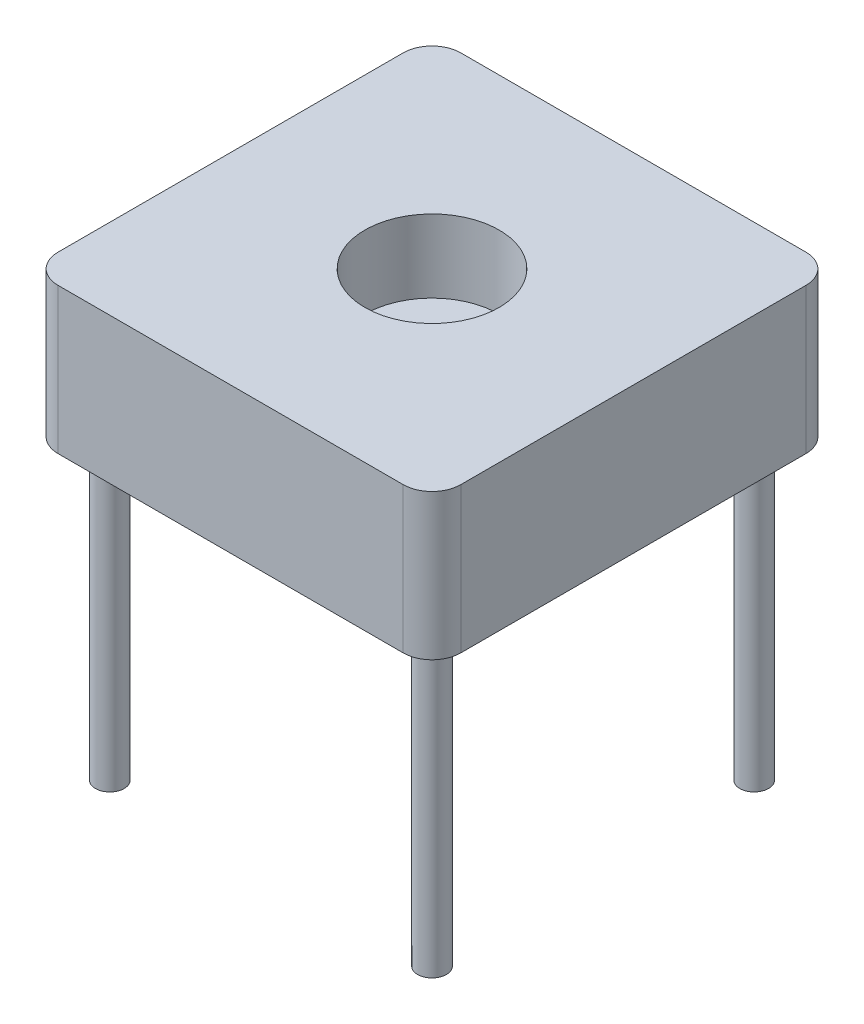
ISO-10303-21;
HEADER;
FILE_DESCRIPTION(('STEP AP214'),'2;1');
FILE_NAME('part.step','',(''),(''),'','','');
FILE_SCHEMA(('AUTOMOTIVE_DESIGN { 1 0 10303 214 1 1 1 1 }'));
ENDSEC;
DATA;
#1=APPLICATION_CONTEXT('core data for automotive mechanical design processes');
#2=APPLICATION_PROTOCOL_DEFINITION('international standard','automotive_design',2000,#1);
#3=PRODUCT_CONTEXT('',#1,'mechanical');
#4=PRODUCT('Part','Part','',(#3));
#5=PRODUCT_RELATED_PRODUCT_CATEGORY('part','',(#4));
#6=PRODUCT_DEFINITION_FORMATION('','',#4);
#7=PRODUCT_DEFINITION_CONTEXT('part definition',#1,'design');
#8=PRODUCT_DEFINITION('design','',#6,#7);
#9=PRODUCT_DEFINITION_SHAPE('','',#8);
#10=(LENGTH_UNIT() NAMED_UNIT(*) SI_UNIT(.MILLI.,.METRE.));
#11=(NAMED_UNIT(*) PLANE_ANGLE_UNIT() SI_UNIT($,.RADIAN.));
#12=(NAMED_UNIT(*) SI_UNIT($,.STERADIAN.) SOLID_ANGLE_UNIT());
#13=UNCERTAINTY_MEASURE_WITH_UNIT(LENGTH_MEASURE(1.E-05),#10,'distance_accuracy_value','');
#14=(GEOMETRIC_REPRESENTATION_CONTEXT(3) GLOBAL_UNCERTAINTY_ASSIGNED_CONTEXT((#13)) GLOBAL_UNIT_ASSIGNED_CONTEXT((#10,
#11,#12)) REPRESENTATION_CONTEXT('',''));
#15=CARTESIAN_POINT('',(0.,0.,0.));
#16=DIRECTION('',(0.,0.,1.));
#17=DIRECTION('',(1.,0.,0.));
#18=AXIS2_PLACEMENT_3D('',#15,#16,#17);
#19=CARTESIAN_POINT('',(0.75,3.8,-9.75));
#20=DIRECTION('',(0.,-1.,0.));
#21=DIRECTION('',(0.,0.,-1.));
#22=AXIS2_PLACEMENT_3D('',#19,#20,#21);
#23=CYLINDRICAL_SURFACE('',#22,0.75);
#24=CARTESIAN_POINT('',(0.75,0.,-9.75));
#25=DIRECTION('',(0.,1.,0.));
#26=DIRECTION('',(0.,0.,-1.));
#27=AXIS2_PLACEMENT_3D('',#24,#25,#26);
#28=CIRCLE('',#27,0.75);
#29=CARTESIAN_POINT('',(0.750000000000005,0.,-10.5));
#30=VERTEX_POINT('',#29);
#31=CARTESIAN_POINT('',(0.,0.,-9.74999999999999));
#32=VERTEX_POINT('',#31);
#33=EDGE_CURVE('E133',#30,#32,#28,.T.);
#34=ORIENTED_EDGE('',*,*,#33,.T.);
#35=DIRECTION('',(0.,-1.,0.));
#36=VECTOR('',#35,1.);
#37=CARTESIAN_POINT('',(0.,3.8,-9.74999999999999));
#38=LINE('',#37,#36);
#39=CARTESIAN_POINT('',(0.,3.8,-9.74999999999999));
#40=VERTEX_POINT('',#39);
#41=EDGE_CURVE('E11',#40,#32,#38,.T.);
#42=ORIENTED_EDGE('',*,*,#41,.F.);
#43=CARTESIAN_POINT('',(0.75,3.8,-9.75));
#44=DIRECTION('',(0.,1.,0.));
#45=DIRECTION('',(0.,0.,-1.));
#46=AXIS2_PLACEMENT_3D('',#43,#44,#45);
#47=CIRCLE('',#46,0.75);
#48=CARTESIAN_POINT('',(0.750000000000005,3.8,-10.5));
#49=VERTEX_POINT('',#48);
#50=EDGE_CURVE('E148',#49,#40,#47,.T.);
#51=ORIENTED_EDGE('',*,*,#50,.F.);
#52=DIRECTION('',(0.,-1.,0.));
#53=VECTOR('',#52,1.);
#54=CARTESIAN_POINT('',(0.750000000000005,3.8,-10.5));
#55=LINE('',#54,#53);
#56=EDGE_CURVE('E129',#49,#30,#55,.T.);
#57=ORIENTED_EDGE('',*,*,#56,.T.);
#58=EDGE_LOOP('',(#34,#42,#51,#57));
#59=FACE_BOUND('',#58,.T.);
#60=ADVANCED_FACE('F37',(#59),#23,.T.);
#61=CARTESIAN_POINT('',(0.,3.8,-0.750000000000005));
#62=DIRECTION('',(1.,0.,0.));
#63=DIRECTION('',(0.,0.,-1.));
#64=AXIS2_PLACEMENT_3D('',#61,#62,#63);
#65=PLANE('',#64);
#66=DIRECTION('',(0.,0.,1.));
#67=VECTOR('',#66,1.);
#68=CARTESIAN_POINT('',(0.,0.,-0.750000000000005));
#69=LINE('',#68,#67);
#70=CARTESIAN_POINT('',(0.,0.,-0.750000000000005));
#71=VERTEX_POINT('',#70);
#72=EDGE_CURVE('E136',#32,#71,#69,.T.);
#73=ORIENTED_EDGE('',*,*,#72,.T.);
#74=DIRECTION('',(0.,-1.,0.));
#75=VECTOR('',#74,1.);
#76=CARTESIAN_POINT('',(0.,3.8,-0.750000000000005));
#77=LINE('',#76,#75);
#78=CARTESIAN_POINT('',(0.,3.8,-0.750000000000005));
#79=VERTEX_POINT('',#78);
#80=EDGE_CURVE('E45',#79,#71,#77,.T.);
#81=ORIENTED_EDGE('',*,*,#80,.F.);
#82=DIRECTION('',(0.,0.,1.));
#83=VECTOR('',#82,1.);
#84=CARTESIAN_POINT('',(0.,3.8,-0.750000000000005));
#85=LINE('',#84,#83);
#86=EDGE_CURVE('E96',#40,#79,#85,.T.);
#87=ORIENTED_EDGE('',*,*,#86,.F.);
#88=ORIENTED_EDGE('',*,*,#41,.T.);
#89=EDGE_LOOP('',(#73,#81,#87,#88));
#90=FACE_BOUND('',#89,.T.);
#91=ADVANCED_FACE('F247',(#90),#65,.F.);
#92=CARTESIAN_POINT('',(0.75,3.8,-0.75));
#93=DIRECTION('',(0.,-1.,0.));
#94=DIRECTION('',(0.,0.,-1.));
#95=AXIS2_PLACEMENT_3D('',#92,#93,#94);
#96=CYLINDRICAL_SURFACE('',#95,0.75);
#97=CARTESIAN_POINT('',(0.75,0.,-0.75));
#98=DIRECTION('',(0.,1.,0.));
#99=DIRECTION('',(0.,0.,-1.));
#100=AXIS2_PLACEMENT_3D('',#97,#98,#99);
#101=CIRCLE('',#100,0.75);
#102=CARTESIAN_POINT('',(0.750000000000005,0.,0.));
#103=VERTEX_POINT('',#102);
#104=EDGE_CURVE('E139',#71,#103,#101,.T.);
#105=ORIENTED_EDGE('',*,*,#104,.T.);
#106=DIRECTION('',(0.,-1.,0.));
#107=VECTOR('',#106,1.);
#108=CARTESIAN_POINT('',(0.750000000000005,3.8,0.));
#109=LINE('',#108,#107);
#110=CARTESIAN_POINT('',(0.750000000000005,3.8,0.));
#111=VERTEX_POINT('',#110);
#112=EDGE_CURVE('E155',#111,#103,#109,.T.);
#113=ORIENTED_EDGE('',*,*,#112,.F.);
#114=CARTESIAN_POINT('',(0.75,3.8,-0.75));
#115=DIRECTION('',(0.,1.,0.));
#116=DIRECTION('',(0.,0.,-1.));
#117=AXIS2_PLACEMENT_3D('',#114,#115,#116);
#118=CIRCLE('',#117,0.75);
#119=EDGE_CURVE('E163',#79,#111,#118,.T.);
#120=ORIENTED_EDGE('',*,*,#119,.F.);
#121=ORIENTED_EDGE('',*,*,#80,.T.);
#122=EDGE_LOOP('',(#105,#113,#120,#121));
#123=FACE_BOUND('',#122,.T.);
#124=ADVANCED_FACE('F161',(#123),#96,.T.);
#125=CARTESIAN_POINT('',(0.750000000000005,3.8,0.));
#126=DIRECTION('',(0.,0.,-1.));
#127=DIRECTION('',(-1.,0.,0.));
#128=AXIS2_PLACEMENT_3D('',#125,#126,#127);
#129=PLANE('',#128);
#130=DIRECTION('',(1.,0.,0.));
#131=VECTOR('',#130,1.);
#132=CARTESIAN_POINT('',(0.750000000000005,0.,0.));
#133=LINE('',#132,#131);
#134=CARTESIAN_POINT('',(9.74999999999999,0.,0.));
#135=VERTEX_POINT('',#134);
#136=EDGE_CURVE('E141',#103,#135,#133,.T.);
#137=ORIENTED_EDGE('',*,*,#136,.T.);
#138=DIRECTION('',(0.,-1.,0.));
#139=VECTOR('',#138,1.);
#140=CARTESIAN_POINT('',(9.74999999999999,3.8,0.));
#141=LINE('',#140,#139);
#142=CARTESIAN_POINT('',(9.74999999999999,3.8,0.));
#143=VERTEX_POINT('',#142);
#144=EDGE_CURVE('E152',#143,#135,#141,.T.);
#145=ORIENTED_EDGE('',*,*,#144,.F.);
#146=DIRECTION('',(1.,0.,0.));
#147=VECTOR('',#146,1.);
#148=CARTESIAN_POINT('',(0.750000000000005,3.8,0.));
#149=LINE('',#148,#147);
#150=EDGE_CURVE('E175',#111,#143,#149,.T.);
#151=ORIENTED_EDGE('',*,*,#150,.F.);
#152=ORIENTED_EDGE('',*,*,#112,.T.);
#153=EDGE_LOOP('',(#137,#145,#151,#152));
#154=FACE_BOUND('',#153,.T.);
#155=ADVANCED_FACE('F171',(#154),#129,.F.);
#156=CARTESIAN_POINT('',(9.75,3.8,-0.75));
#157=DIRECTION('',(0.,-1.,0.));
#158=DIRECTION('',(0.,0.,-1.));
#159=AXIS2_PLACEMENT_3D('',#156,#157,#158);
#160=CYLINDRICAL_SURFACE('',#159,0.75);
#161=CARTESIAN_POINT('',(9.75,0.,-0.75));
#162=DIRECTION('',(0.,1.,0.));
#163=DIRECTION('',(0.,0.,-1.));
#164=AXIS2_PLACEMENT_3D('',#161,#162,#163);
#165=CIRCLE('',#164,0.75);
#166=CARTESIAN_POINT('',(10.5,0.,-0.750000000000005));
#167=VERTEX_POINT('',#166);
#168=EDGE_CURVE('E143',#135,#167,#165,.T.);
#169=ORIENTED_EDGE('',*,*,#168,.T.);
#170=DIRECTION('',(0.,-1.,0.));
#171=VECTOR('',#170,1.);
#172=CARTESIAN_POINT('',(10.5,3.8,-0.750000000000005));
#173=LINE('',#172,#171);
#174=CARTESIAN_POINT('',(10.5,3.8,-0.750000000000005));
#175=VERTEX_POINT('',#174);
#176=EDGE_CURVE('E124',#175,#167,#173,.T.);
#177=ORIENTED_EDGE('',*,*,#176,.F.);
#178=CARTESIAN_POINT('',(9.75,3.8,-0.75));
#179=DIRECTION('',(0.,1.,0.));
#180=DIRECTION('',(0.,0.,-1.));
#181=AXIS2_PLACEMENT_3D('',#178,#179,#180);
#182=CIRCLE('',#181,0.75);
#183=EDGE_CURVE('E115',#143,#175,#182,.T.);
#184=ORIENTED_EDGE('',*,*,#183,.F.);
#185=ORIENTED_EDGE('',*,*,#144,.T.);
#186=EDGE_LOOP('',(#169,#177,#184,#185));
#187=FACE_BOUND('',#186,.T.);
#188=ADVANCED_FACE('F174',(#187),#160,.T.);
#189=CARTESIAN_POINT('',(10.5,3.8,-0.750000000000005));
#190=DIRECTION('',(-1.,0.,0.));
#191=DIRECTION('',(0.,0.,1.));
#192=AXIS2_PLACEMENT_3D('',#189,#190,#191);
#193=PLANE('',#192);
#194=DIRECTION('',(0.,0.,-1.));
#195=VECTOR('',#194,1.);
#196=CARTESIAN_POINT('',(10.5,0.,-0.750000000000005));
#197=LINE('',#196,#195);
#198=CARTESIAN_POINT('',(10.5,0.,-9.74999999999999));
#199=VERTEX_POINT('',#198);
#200=EDGE_CURVE('E123',#167,#199,#197,.T.);
#201=ORIENTED_EDGE('',*,*,#200,.T.);
#202=DIRECTION('',(0.,-1.,0.));
#203=VECTOR('',#202,1.);
#204=CARTESIAN_POINT('',(10.5,3.8,-9.74999999999999));
#205=LINE('',#204,#203);
#206=CARTESIAN_POINT('',(10.5,3.8,-9.74999999999999));
#207=VERTEX_POINT('',#206);
#208=EDGE_CURVE('E120',#207,#199,#205,.T.);
#209=ORIENTED_EDGE('',*,*,#208,.F.);
#210=DIRECTION('',(0.,0.,-1.));
#211=VECTOR('',#210,1.);
#212=CARTESIAN_POINT('',(10.5,3.8,-0.750000000000005));
#213=LINE('',#212,#211);
#214=EDGE_CURVE('E109',#175,#207,#213,.T.);
#215=ORIENTED_EDGE('',*,*,#214,.F.);
#216=ORIENTED_EDGE('',*,*,#176,.T.);
#217=EDGE_LOOP('',(#201,#209,#215,#216));
#218=FACE_BOUND('',#217,.T.);
#219=ADVANCED_FACE('F121',(#218),#193,.F.);
#220=CARTESIAN_POINT('',(9.75,3.8,-9.75));
#221=DIRECTION('',(0.,-1.,0.));
#222=DIRECTION('',(0.,0.,-1.));
#223=AXIS2_PLACEMENT_3D('',#220,#221,#222);
#224=CYLINDRICAL_SURFACE('',#223,0.750000000000001);
#225=CARTESIAN_POINT('',(9.75,0.,-9.75));
#226=DIRECTION('',(0.,1.,0.));
#227=DIRECTION('',(0.,0.,-1.));
#228=AXIS2_PLACEMENT_3D('',#225,#226,#227);
#229=CIRCLE('',#228,0.750000000000001);
#230=CARTESIAN_POINT('',(9.74999999999999,0.,-10.5));
#231=VERTEX_POINT('',#230);
#232=EDGE_CURVE('E82',#199,#231,#229,.T.);
#233=ORIENTED_EDGE('',*,*,#232,.T.);
#234=DIRECTION('',(0.,-1.,0.));
#235=VECTOR('',#234,1.);
#236=CARTESIAN_POINT('',(9.74999999999999,3.8,-10.5));
#237=LINE('',#236,#235);
#238=CARTESIAN_POINT('',(9.74999999999999,3.8,-10.5));
#239=VERTEX_POINT('',#238);
#240=EDGE_CURVE('E125',#239,#231,#237,.T.);
#241=ORIENTED_EDGE('',*,*,#240,.F.);
#242=CARTESIAN_POINT('',(9.75,3.8,-9.75));
#243=DIRECTION('',(0.,1.,0.));
#244=DIRECTION('',(0.,0.,-1.));
#245=AXIS2_PLACEMENT_3D('',#242,#243,#244);
#246=CIRCLE('',#245,0.750000000000001);
#247=EDGE_CURVE('E113',#207,#239,#246,.T.);
#248=ORIENTED_EDGE('',*,*,#247,.F.);
#249=ORIENTED_EDGE('',*,*,#208,.T.);
#250=EDGE_LOOP('',(#233,#241,#248,#249));
#251=FACE_BOUND('',#250,.T.);
#252=ADVANCED_FACE('F127',(#251),#224,.T.);
#253=CARTESIAN_POINT('',(0.750000000000005,3.8,-10.5));
#254=DIRECTION('',(0.,0.,1.));
#255=DIRECTION('',(1.,0.,0.));
#256=AXIS2_PLACEMENT_3D('',#253,#254,#255);
#257=PLANE('',#256);
#258=DIRECTION('',(-1.,0.,0.));
#259=VECTOR('',#258,1.);
#260=CARTESIAN_POINT('',(0.750000000000005,0.,-10.5));
#261=LINE('',#260,#259);
#262=EDGE_CURVE('E88',#231,#30,#261,.T.);
#263=ORIENTED_EDGE('',*,*,#262,.T.);
#264=ORIENTED_EDGE('',*,*,#56,.F.);
#265=DIRECTION('',(-1.,0.,0.));
#266=VECTOR('',#265,1.);
#267=CARTESIAN_POINT('',(0.750000000000005,3.8,-10.5));
#268=LINE('',#267,#266);
#269=EDGE_CURVE('E53',#239,#49,#268,.T.);
#270=ORIENTED_EDGE('',*,*,#269,.F.);
#271=ORIENTED_EDGE('',*,*,#240,.T.);
#272=EDGE_LOOP('',(#263,#264,#270,#271));
#273=FACE_BOUND('',#272,.T.);
#274=ADVANCED_FACE('F254',(#273),#257,.F.);
#275=CARTESIAN_POINT('',(0.75,3.8,-9.75));
#276=DIRECTION('',(0.,-1.,0.));
#277=DIRECTION('',(0.,0.,-1.));
#278=AXIS2_PLACEMENT_3D('',#275,#276,#277);
#279=PLANE('',#278);
#280=CARTESIAN_POINT('',(5.25,3.8,-5.25));
#281=DIRECTION('',(0.,1.,0.));
#282=DIRECTION('',(0.,0.,1.));
#283=AXIS2_PLACEMENT_3D('',#280,#281,#282);
#284=CIRCLE('',#283,1.75);
#285=CARTESIAN_POINT('',(5.25,3.8,-3.5));
#286=VERTEX_POINT('',#285);
#287=EDGE_CURVE('E181',#286,#286,#284,.T.);
#288=ORIENTED_EDGE('',*,*,#287,.F.);
#289=EDGE_LOOP('',(#288));
#290=FACE_BOUND('',#289,.T.);
#291=ORIENTED_EDGE('',*,*,#50,.T.);
#292=ORIENTED_EDGE('',*,*,#86,.T.);
#293=ORIENTED_EDGE('',*,*,#119,.T.);
#294=ORIENTED_EDGE('',*,*,#150,.T.);
#295=ORIENTED_EDGE('',*,*,#183,.T.);
#296=ORIENTED_EDGE('',*,*,#214,.T.);
#297=ORIENTED_EDGE('',*,*,#247,.T.);
#298=ORIENTED_EDGE('',*,*,#269,.T.);
#299=EDGE_LOOP('',(#291,#292,#293,#294,#295,#296,#297,#298));
#300=FACE_BOUND('',#299,.T.);
#301=ADVANCED_FACE('F111',(#290,#300),#279,.F.);
#302=CARTESIAN_POINT('',(0.75,0.,-9.75));
#303=DIRECTION('',(0.,-1.,0.));
#304=DIRECTION('',(0.,0.,-1.));
#305=AXIS2_PLACEMENT_3D('',#302,#303,#304);
#306=PLANE('',#305);
#307=CARTESIAN_POINT('',(1.05,0.,-1.05));
#308=DIRECTION('',(0.,-1.,0.));
#309=DIRECTION('',(0.,0.,-1.));
#310=AXIS2_PLACEMENT_3D('',#307,#308,#309);
#311=CIRCLE('',#310,0.375);
#312=CARTESIAN_POINT('',(1.05,0.,-1.425));
#313=VERTEX_POINT('',#312);
#314=EDGE_CURVE('E205',#313,#313,#311,.T.);
#315=ORIENTED_EDGE('',*,*,#314,.F.);
#316=EDGE_LOOP('',(#315));
#317=FACE_BOUND('',#316,.T.);
#318=CARTESIAN_POINT('',(9.45,0.,-1.05));
#319=DIRECTION('',(0.,-1.,0.));
#320=DIRECTION('',(0.,0.,-1.));
#321=AXIS2_PLACEMENT_3D('',#318,#319,#320);
#322=CIRCLE('',#321,0.375000000000001);
#323=CARTESIAN_POINT('',(9.45,0.,-1.425));
#324=VERTEX_POINT('',#323);
#325=EDGE_CURVE('E199',#324,#324,#322,.T.);
#326=ORIENTED_EDGE('',*,*,#325,.F.);
#327=EDGE_LOOP('',(#326));
#328=FACE_BOUND('',#327,.T.);
#329=CARTESIAN_POINT('',(1.05,0.,-9.45));
#330=DIRECTION('',(0.,-1.,0.));
#331=DIRECTION('',(0.,0.,-1.));
#332=AXIS2_PLACEMENT_3D('',#329,#330,#331);
#333=CIRCLE('',#332,0.375);
#334=CARTESIAN_POINT('',(1.05,0.,-9.825));
#335=VERTEX_POINT('',#334);
#336=EDGE_CURVE('E193',#335,#335,#333,.T.);
#337=ORIENTED_EDGE('',*,*,#336,.F.);
#338=EDGE_LOOP('',(#337));
#339=FACE_BOUND('',#338,.T.);
#340=CARTESIAN_POINT('',(9.45,0.,-9.45));
#341=DIRECTION('',(0.,-1.,0.));
#342=DIRECTION('',(0.,0.,-1.));
#343=AXIS2_PLACEMENT_3D('',#340,#341,#342);
#344=CIRCLE('',#343,0.375000000000001);
#345=CARTESIAN_POINT('',(9.45,0.,-9.825));
#346=VERTEX_POINT('',#345);
#347=EDGE_CURVE('E187',#346,#346,#344,.T.);
#348=ORIENTED_EDGE('',*,*,#347,.F.);
#349=EDGE_LOOP('',(#348));
#350=FACE_BOUND('',#349,.T.);
#351=ORIENTED_EDGE('',*,*,#33,.F.);
#352=ORIENTED_EDGE('',*,*,#262,.F.);
#353=ORIENTED_EDGE('',*,*,#232,.F.);
#354=ORIENTED_EDGE('',*,*,#200,.F.);
#355=ORIENTED_EDGE('',*,*,#168,.F.);
#356=ORIENTED_EDGE('',*,*,#136,.F.);
#357=ORIENTED_EDGE('',*,*,#104,.F.);
#358=ORIENTED_EDGE('',*,*,#72,.F.);
#359=EDGE_LOOP('',(#351,#352,#353,#354,#355,#356,#357,#358));
#360=FACE_BOUND('',#359,.T.);
#361=ADVANCED_FACE('F167',(#317,#328,#339,#350,#360),#306,.T.);
#362=CARTESIAN_POINT('',(5.25,1.9,-5.25));
#363=DIRECTION('',(0.,1.,0.));
#364=DIRECTION('',(0.,0.,1.));
#365=AXIS2_PLACEMENT_3D('',#362,#363,#364);
#366=CYLINDRICAL_SURFACE('',#365,1.75);
#367=CARTESIAN_POINT('',(5.25,1.9,-5.25));
#368=DIRECTION('',(0.,1.,0.));
#369=DIRECTION('',(0.,0.,1.));
#370=AXIS2_PLACEMENT_3D('',#367,#368,#369);
#371=CIRCLE('',#370,1.75);
#372=CARTESIAN_POINT('',(5.25,1.9,-3.5));
#373=VERTEX_POINT('',#372);
#374=EDGE_CURVE('E137',#373,#373,#371,.T.);
#375=CARTESIAN_POINT('',(5.25,1.9,-3.5));
#376=CARTESIAN_POINT('',(5.25,1.91979166666667,-3.5));
#377=CARTESIAN_POINT('',(5.25,1.93958333333333,-3.5));
#378=CARTESIAN_POINT('',(5.25,1.97916666666667,-3.5));
#379=CARTESIAN_POINT('',(5.25,1.99895833333333,-3.5));
#380=CARTESIAN_POINT('',(5.25,2.03854166666667,-3.5));
#381=CARTESIAN_POINT('',(5.25,2.05833333333333,-3.5));
#382=CARTESIAN_POINT('',(5.25,2.09791666666667,-3.5));
#383=CARTESIAN_POINT('',(5.25,2.11770833333333,-3.5));
#384=CARTESIAN_POINT('',(5.25,2.15729166666667,-3.5));
#385=CARTESIAN_POINT('',(5.25,2.17708333333333,-3.5));
#386=CARTESIAN_POINT('',(5.25,2.21666666666667,-3.5));
#387=CARTESIAN_POINT('',(5.25,2.23645833333333,-3.5));
#388=CARTESIAN_POINT('',(5.25,2.27604166666667,-3.5));
#389=CARTESIAN_POINT('',(5.25,2.29583333333333,-3.5));
#390=CARTESIAN_POINT('',(5.25,2.33541666666667,-3.5));
#391=CARTESIAN_POINT('',(5.25,2.35520833333333,-3.5));
#392=CARTESIAN_POINT('',(5.25,2.39479166666667,-3.5));
#393=CARTESIAN_POINT('',(5.25,2.41458333333333,-3.5));
#394=CARTESIAN_POINT('',(5.25,2.45416666666667,-3.5));
#395=CARTESIAN_POINT('',(5.25,2.47395833333333,-3.5));
#396=CARTESIAN_POINT('',(5.25,2.51354166666667,-3.5));
#397=CARTESIAN_POINT('',(5.25,2.53333333333333,-3.5));
#398=CARTESIAN_POINT('',(5.25,2.57291666666667,-3.5));
#399=CARTESIAN_POINT('',(5.25,2.59270833333333,-3.5));
#400=CARTESIAN_POINT('',(5.25,2.63229166666667,-3.5));
#401=CARTESIAN_POINT('',(5.25,2.65208333333333,-3.5));
#402=CARTESIAN_POINT('',(5.25,2.69166666666667,-3.5));
#403=CARTESIAN_POINT('',(5.25,2.71145833333333,-3.5));
#404=CARTESIAN_POINT('',(5.25,2.75104166666667,-3.5));
#405=CARTESIAN_POINT('',(5.25,2.77083333333333,-3.5));
#406=CARTESIAN_POINT('',(5.25,2.81041666666667,-3.5));
#407=CARTESIAN_POINT('',(5.25,2.83020833333333,-3.5));
#408=CARTESIAN_POINT('',(5.25,2.86979166666667,-3.5));
#409=CARTESIAN_POINT('',(5.25,2.88958333333333,-3.5));
#410=CARTESIAN_POINT('',(5.25,2.92916666666667,-3.5));
#411=CARTESIAN_POINT('',(5.25,2.94895833333333,-3.5));
#412=CARTESIAN_POINT('',(5.25,2.98854166666667,-3.5));
#413=CARTESIAN_POINT('',(5.25,3.00833333333333,-3.5));
#414=CARTESIAN_POINT('',(5.25,3.04791666666667,-3.5));
#415=CARTESIAN_POINT('',(5.25,3.06770833333333,-3.5));
#416=CARTESIAN_POINT('',(5.25,3.10729166666667,-3.5));
#417=CARTESIAN_POINT('',(5.25,3.12708333333333,-3.5));
#418=CARTESIAN_POINT('',(5.25,3.16666666666667,-3.5));
#419=CARTESIAN_POINT('',(5.25,3.18645833333333,-3.5));
#420=CARTESIAN_POINT('',(5.25,3.22604166666667,-3.5));
#421=CARTESIAN_POINT('',(5.25,3.24583333333333,-3.5));
#422=CARTESIAN_POINT('',(5.25,3.28541666666667,-3.5));
#423=CARTESIAN_POINT('',(5.25,3.30520833333333,-3.5));
#424=CARTESIAN_POINT('',(5.25,3.34479166666667,-3.5));
#425=CARTESIAN_POINT('',(5.25,3.36458333333333,-3.5));
#426=CARTESIAN_POINT('',(5.25,3.40416666666667,-3.5));
#427=CARTESIAN_POINT('',(5.25,3.42395833333333,-3.5));
#428=CARTESIAN_POINT('',(5.25,3.46354166666667,-3.5));
#429=CARTESIAN_POINT('',(5.25,3.48333333333333,-3.5));
#430=CARTESIAN_POINT('',(5.25,3.52291666666667,-3.5));
#431=CARTESIAN_POINT('',(5.25,3.54270833333333,-3.5));
#432=CARTESIAN_POINT('',(5.25,3.58229166666667,-3.5));
#433=CARTESIAN_POINT('',(5.25,3.60208333333333,-3.5));
#434=CARTESIAN_POINT('',(5.25,3.64166666666667,-3.5));
#435=CARTESIAN_POINT('',(5.25,3.66145833333333,-3.5));
#436=CARTESIAN_POINT('',(5.25,3.70104166666667,-3.5));
#437=CARTESIAN_POINT('',(5.25,3.72083333333333,-3.5));
#438=CARTESIAN_POINT('',(5.25,3.76041666666667,-3.5));
#439=CARTESIAN_POINT('',(5.25,3.78020833333333,-3.5));
#440=CARTESIAN_POINT('',(5.25,3.8,-3.5));
#441=B_SPLINE_CURVE_WITH_KNOTS('',3,(#375,#376,#377,#378,#379,#380,#381,#382,#383,#384,#385,
#386,#387,#388,#389,#390,#391,#392,#393,#394,#395,#396,#397,#398,#399,#400,#401,#402,#403,#404,
#405,#406,#407,#408,#409,#410,#411,#412,#413,#414,#415,#416,#417,#418,#419,#420,#421,#422,#423,
#424,#425,#426,#427,#428,#429,#430,#431,#432,#433,#434,#435,#436,#437,#438,#439,#440),
.UNSPECIFIED.,.F.,.F.,(4,2,2,2,2,2,2,2,2,2,2,2,2,2,2,2,2,2,2,2,2,2,2,2,2,2,2,2,2,2,2,2,4),(0.,
0.059375,0.11875,0.178125,0.2375,0.296875,0.35625,0.415625,0.475,0.534375,0.59375,0.653125,
0.7125,0.771875,0.83125,0.890625,0.95,1.009375,1.06875,1.128125,1.1875,1.246875,1.30625,
1.365625,1.425,1.484375,1.54375,1.603125,1.6625,1.721875,1.78125,1.840625,1.9),.UNSPECIFIED.);
#442=EDGE_CURVE('BSEAM222',#373,#286,#441,.T.);
#443=ORIENTED_EDGE('',*,*,#374,.F.);
#444=ORIENTED_EDGE('',*,*,#287,.T.);
#445=ORIENTED_EDGE('',*,*,#442,.T.);
#446=ORIENTED_EDGE('',*,*,#442,.F.);
#447=EDGE_LOOP('',(#443,#445,#444,#446));
#448=FACE_BOUND('',#447,.T.);
#449=ADVANCED_FACE('F222',(#448),#366,.F.);
#450=CARTESIAN_POINT('',(5.25,1.9,-5.25));
#451=DIRECTION('',(0.,1.,0.));
#452=DIRECTION('',(0.,0.,1.));
#453=AXIS2_PLACEMENT_3D('',#450,#451,#452);
#454=PLANE('',#453);
#455=ORIENTED_EDGE('',*,*,#374,.T.);
#456=EDGE_LOOP('',(#455));
#457=FACE_BOUND('',#456,.T.);
#458=ADVANCED_FACE('F233',(#457),#454,.T.);
#459=CARTESIAN_POINT('',(9.45,-7.75,-9.45));
#460=DIRECTION('',(0.,1.,0.));
#461=DIRECTION('',(0.,0.,1.));
#462=AXIS2_PLACEMENT_3D('',#459,#460,#461);
#463=CYLINDRICAL_SURFACE('',#462,0.375000000000001);
#464=CARTESIAN_POINT('',(9.45,-7.75,-9.45));
#465=DIRECTION('',(0.,-1.,0.));
#466=DIRECTION('',(0.,0.,-1.));
#467=AXIS2_PLACEMENT_3D('',#464,#465,#466);
#468=CIRCLE('',#467,0.375000000000001);
#469=CARTESIAN_POINT('',(9.45,-7.75,-9.825));
#470=VERTEX_POINT('',#469);
#471=EDGE_CURVE('E184',#470,#470,#468,.T.);
#472=ORIENTED_EDGE('',*,*,#471,.F.);
#473=EDGE_LOOP('',(#472));
#474=FACE_BOUND('',#473,.T.);
#475=ORIENTED_EDGE('',*,*,#347,.T.);
#476=EDGE_LOOP('',(#475));
#477=FACE_BOUND('',#476,.T.);
#478=ADVANCED_FACE('F230',(#474,#477),#463,.T.);
#479=CARTESIAN_POINT('',(9.45,-7.75,-9.45));
#480=DIRECTION('',(0.,-1.,0.));
#481=DIRECTION('',(0.,0.,-1.));
#482=AXIS2_PLACEMENT_3D('',#479,#480,#481);
#483=PLANE('',#482);
#484=ORIENTED_EDGE('',*,*,#471,.T.);
#485=EDGE_LOOP('',(#484));
#486=FACE_BOUND('',#485,.T.);
#487=ADVANCED_FACE('F232',(#486),#483,.T.);
#488=CARTESIAN_POINT('',(1.05,-7.75,-9.45));
#489=DIRECTION('',(0.,1.,0.));
#490=DIRECTION('',(0.,0.,1.));
#491=AXIS2_PLACEMENT_3D('',#488,#489,#490);
#492=CYLINDRICAL_SURFACE('',#491,0.375);
#493=CARTESIAN_POINT('',(1.05,-7.75,-9.45));
#494=DIRECTION('',(0.,-1.,0.));
#495=DIRECTION('',(0.,0.,-1.));
#496=AXIS2_PLACEMENT_3D('',#493,#494,#495);
#497=CIRCLE('',#496,0.375);
#498=CARTESIAN_POINT('',(1.05,-7.75,-9.825));
#499=VERTEX_POINT('',#498);
#500=EDGE_CURVE('E190',#499,#499,#497,.T.);
#501=ORIENTED_EDGE('',*,*,#500,.F.);
#502=EDGE_LOOP('',(#501));
#503=FACE_BOUND('',#502,.T.);
#504=ORIENTED_EDGE('',*,*,#336,.T.);
#505=EDGE_LOOP('',(#504));
#506=FACE_BOUND('',#505,.T.);
#507=ADVANCED_FACE('F240',(#503,#506),#492,.T.);
#508=CARTESIAN_POINT('',(1.05,-7.75,-9.45));
#509=DIRECTION('',(0.,-1.,0.));
#510=DIRECTION('',(0.,0.,-1.));
#511=AXIS2_PLACEMENT_3D('',#508,#509,#510);
#512=PLANE('',#511);
#513=ORIENTED_EDGE('',*,*,#500,.T.);
#514=EDGE_LOOP('',(#513));
#515=FACE_BOUND('',#514,.T.);
#516=ADVANCED_FACE('F342',(#515),#512,.T.);
#517=CARTESIAN_POINT('',(9.45,-7.75,-1.05));
#518=DIRECTION('',(0.,1.,0.));
#519=DIRECTION('',(0.,0.,1.));
#520=AXIS2_PLACEMENT_3D('',#517,#518,#519);
#521=CYLINDRICAL_SURFACE('',#520,0.375000000000001);
#522=CARTESIAN_POINT('',(9.45,-7.75,-1.05));
#523=DIRECTION('',(0.,-1.,0.));
#524=DIRECTION('',(0.,0.,-1.));
#525=AXIS2_PLACEMENT_3D('',#522,#523,#524);
#526=CIRCLE('',#525,0.375000000000001);
#527=CARTESIAN_POINT('',(9.45,-7.75,-1.425));
#528=VERTEX_POINT('',#527);
#529=EDGE_CURVE('E196',#528,#528,#526,.T.);
#530=ORIENTED_EDGE('',*,*,#529,.F.);
#531=EDGE_LOOP('',(#530));
#532=FACE_BOUND('',#531,.T.);
#533=ORIENTED_EDGE('',*,*,#325,.T.);
#534=EDGE_LOOP('',(#533));
#535=FACE_BOUND('',#534,.T.);
#536=ADVANCED_FACE('F352',(#532,#535),#521,.T.);
#537=CARTESIAN_POINT('',(9.45,-7.75,-1.05));
#538=DIRECTION('',(0.,-1.,0.));
#539=DIRECTION('',(0.,0.,-1.));
#540=AXIS2_PLACEMENT_3D('',#537,#538,#539);
#541=PLANE('',#540);
#542=ORIENTED_EDGE('',*,*,#529,.T.);
#543=EDGE_LOOP('',(#542));
#544=FACE_BOUND('',#543,.T.);
#545=ADVANCED_FACE('F216',(#544),#541,.T.);
#546=CARTESIAN_POINT('',(1.05,-7.75,-1.05));
#547=DIRECTION('',(0.,1.,0.));
#548=DIRECTION('',(0.,0.,1.));
#549=AXIS2_PLACEMENT_3D('',#546,#547,#548);
#550=CYLINDRICAL_SURFACE('',#549,0.375);
#551=CARTESIAN_POINT('',(1.05,-7.75,-1.05));
#552=DIRECTION('',(0.,-1.,0.));
#553=DIRECTION('',(0.,0.,-1.));
#554=AXIS2_PLACEMENT_3D('',#551,#552,#553);
#555=CIRCLE('',#554,0.375);
#556=CARTESIAN_POINT('',(1.05,-7.75,-1.425));
#557=VERTEX_POINT('',#556);
#558=EDGE_CURVE('E202',#557,#557,#555,.T.);
#559=ORIENTED_EDGE('',*,*,#558,.F.);
#560=EDGE_LOOP('',(#559));
#561=FACE_BOUND('',#560,.T.);
#562=ORIENTED_EDGE('',*,*,#314,.T.);
#563=EDGE_LOOP('',(#562));
#564=FACE_BOUND('',#563,.T.);
#565=ADVANCED_FACE('F213',(#561,#564),#550,.T.);
#566=CARTESIAN_POINT('',(1.05,-7.75,-1.05));
#567=DIRECTION('',(0.,-1.,0.));
#568=DIRECTION('',(0.,0.,-1.));
#569=AXIS2_PLACEMENT_3D('',#566,#567,#568);
#570=PLANE('',#569);
#571=ORIENTED_EDGE('',*,*,#558,.T.);
#572=EDGE_LOOP('',(#571));
#573=FACE_BOUND('',#572,.T.);
#574=ADVANCED_FACE('F211',(#573),#570,.T.);
#575=CLOSED_SHELL('',(#60,#91,#124,#155,#188,#219,#252,#274,#301,#361,#449,#458,#478,#487,#507,
#516,#536,#545,#565,#574));
#576=MANIFOLD_SOLID_BREP('B2',#575);
#577=ADVANCED_BREP_SHAPE_REPRESENTATION('',(#18,#576),#14);
#578=SHAPE_DEFINITION_REPRESENTATION(#9,#577);
ENDSEC;
END-ISO-10303-21;
